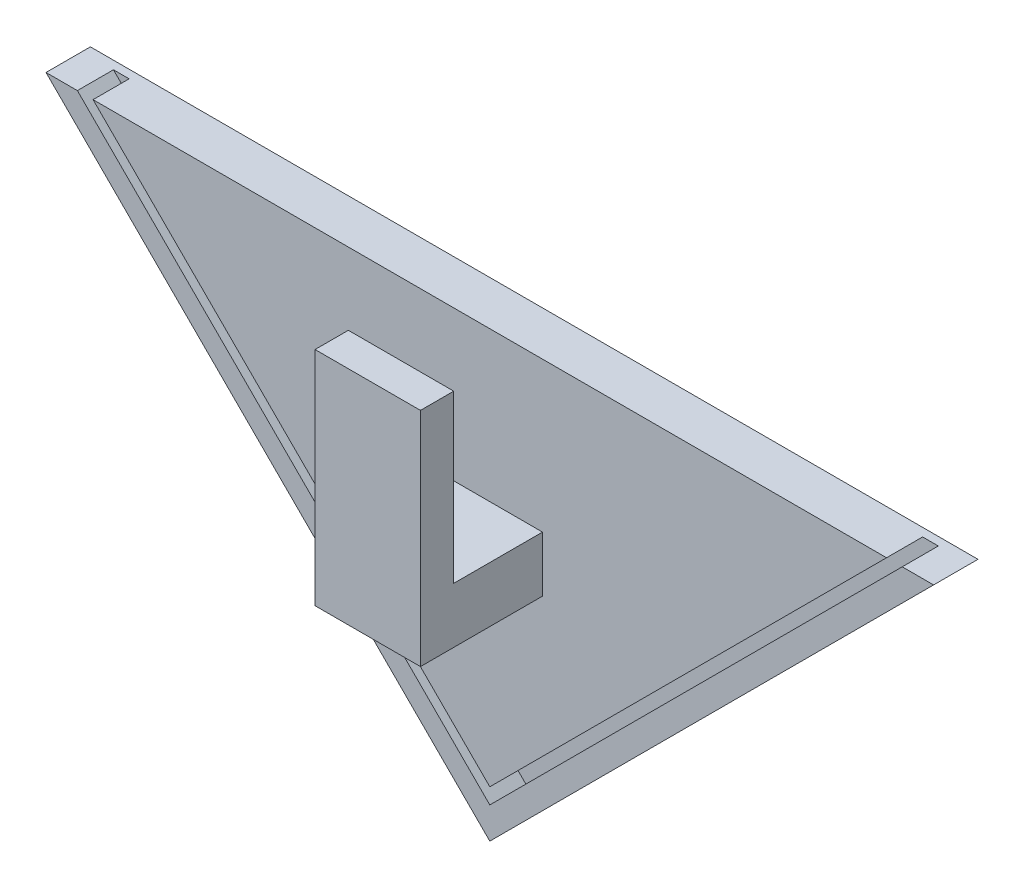
ISO-10303-21;
HEADER;
FILE_DESCRIPTION(('STEP AP214'),'2;1');
FILE_NAME('part.step','',(''),(''),'','','');
FILE_SCHEMA(('AUTOMOTIVE_DESIGN { 1 0 10303 214 1 1 1 1 }'));
ENDSEC;
DATA;
#1=APPLICATION_CONTEXT('core data for automotive mechanical design processes');
#2=APPLICATION_PROTOCOL_DEFINITION('international standard','automotive_design',2000,#1);
#3=PRODUCT_CONTEXT('',#1,'mechanical');
#4=PRODUCT('Part','Part','',(#3));
#5=PRODUCT_RELATED_PRODUCT_CATEGORY('part','',(#4));
#6=PRODUCT_DEFINITION_FORMATION('','',#4);
#7=PRODUCT_DEFINITION_CONTEXT('part definition',#1,'design');
#8=PRODUCT_DEFINITION('design','',#6,#7);
#9=PRODUCT_DEFINITION_SHAPE('','',#8);
#10=(LENGTH_UNIT() NAMED_UNIT(*) SI_UNIT(.MILLI.,.METRE.));
#11=(NAMED_UNIT(*) PLANE_ANGLE_UNIT() SI_UNIT($,.RADIAN.));
#12=(NAMED_UNIT(*) SI_UNIT($,.STERADIAN.) SOLID_ANGLE_UNIT());
#13=UNCERTAINTY_MEASURE_WITH_UNIT(LENGTH_MEASURE(1.E-05),#10,'distance_accuracy_value','');
#14=(GEOMETRIC_REPRESENTATION_CONTEXT(3) GLOBAL_UNCERTAINTY_ASSIGNED_CONTEXT((#13)) GLOBAL_UNIT_ASSIGNED_CONTEXT((#10,
#11,#12)) REPRESENTATION_CONTEXT('',''));
#15=CARTESIAN_POINT('',(0.,0.,0.));
#16=DIRECTION('',(0.,0.,1.));
#17=DIRECTION('',(1.,0.,0.));
#18=AXIS2_PLACEMENT_3D('',#15,#16,#17);
#19=CARTESIAN_POINT('',(0.,0.,4.));
#20=DIRECTION('',(0.,0.,-1.));
#21=DIRECTION('',(-1.,0.,0.));
#22=AXIS2_PLACEMENT_3D('',#19,#20,#21);
#23=PLANE('',#22);
#24=DIRECTION('',(-1.,0.,0.));
#25=VECTOR('',#24,1.);
#26=CARTESIAN_POINT('',(39.9999999999999,40.,4.));
#27=LINE('',#26,#25);
#28=CARTESIAN_POINT('',(35.7573593128806,40.,4.));
#29=VERTEX_POINT('',#28);
#30=CARTESIAN_POINT('',(-35.7573593128806,40.,4.));
#31=VERTEX_POINT('',#30);
#32=EDGE_CURVE('E286',#29,#31,#27,.T.);
#33=ORIENTED_EDGE('',*,*,#32,.T.);
#34=DIRECTION('',(-0.707106781186548,0.707106781186548,0.));
#35=VECTOR('',#34,1.);
#36=CARTESIAN_POINT('',(0.,4.24264068711942,4.));
#37=LINE('',#36,#35);
#38=CARTESIAN_POINT('',(0.,4.24264068711942,4.));
#39=VERTEX_POINT('',#38);
#40=EDGE_CURVE('E249',#39,#31,#37,.T.);
#41=ORIENTED_EDGE('',*,*,#40,.F.);
#42=DIRECTION('',(-0.707106781186547,-0.707106781186548,0.));
#43=VECTOR('',#42,1.);
#44=CARTESIAN_POINT('',(35.7573593128806,40.,4.));
#45=LINE('',#44,#43);
#46=EDGE_CURVE('E245',#29,#39,#45,.T.);
#47=ORIENTED_EDGE('',*,*,#46,.F.);
#48=EDGE_LOOP('',(#33,#41,#47));
#49=FACE_BOUND('',#48,.T.);
#50=DIRECTION('',(0.,1.,0.));
#51=VECTOR('',#50,1.);
#52=CARTESIAN_POINT('',(4.75,21.5,4.));
#53=LINE('',#52,#51);
#54=CARTESIAN_POINT('',(4.75,21.5,4.));
#55=VERTEX_POINT('',#54);
#56=CARTESIAN_POINT('',(4.75,26.5,4.));
#57=VERTEX_POINT('',#56);
#58=EDGE_CURVE('E195',#55,#57,#53,.T.);
#59=ORIENTED_EDGE('',*,*,#58,.F.);
#60=DIRECTION('',(1.,0.,0.));
#61=VECTOR('',#60,1.);
#62=CARTESIAN_POINT('',(-4.75,21.5,4.));
#63=LINE('',#62,#61);
#64=CARTESIAN_POINT('',(-4.75,21.5,4.));
#65=VERTEX_POINT('',#64);
#66=EDGE_CURVE('E200',#65,#55,#63,.T.);
#67=ORIENTED_EDGE('',*,*,#66,.F.);
#68=DIRECTION('',(0.,-1.,0.));
#69=VECTOR('',#68,1.);
#70=CARTESIAN_POINT('',(-4.75,21.5,4.));
#71=LINE('',#70,#69);
#72=CARTESIAN_POINT('',(-4.75,26.5,4.));
#73=VERTEX_POINT('',#72);
#74=EDGE_CURVE('E60',#73,#65,#71,.T.);
#75=ORIENTED_EDGE('',*,*,#74,.F.);
#76=DIRECTION('',(-1.,0.,0.));
#77=VECTOR('',#76,1.);
#78=CARTESIAN_POINT('',(-4.75,26.5,4.));
#79=LINE('',#78,#77);
#80=EDGE_CURVE('E55',#57,#73,#79,.T.);
#81=ORIENTED_EDGE('',*,*,#80,.F.);
#82=EDGE_LOOP('',(#59,#67,#75,#81));
#83=FACE_BOUND('',#82,.T.);
#84=ADVANCED_FACE('F39',(#49,#83),#23,.F.);
#85=CARTESIAN_POINT('',(39.9999999999999,40.,4.));
#86=VERTEX_POINT('',#85);
#87=CARTESIAN_POINT('',(37.1715728752536,40.,4.));
#88=VERTEX_POINT('',#87);
#89=EDGE_CURVE('E281',#86,#88,#27,.T.);
#90=ORIENTED_EDGE('',*,*,#89,.T.);
#91=DIRECTION('',(0.707106781186547,0.707106781186548,0.));
#92=VECTOR('',#91,1.);
#93=CARTESIAN_POINT('',(37.1715728752536,40.,4.));
#94=LINE('',#93,#92);
#95=CARTESIAN_POINT('',(0.,2.82842712474633,4.));
#96=VERTEX_POINT('',#95);
#97=EDGE_CURVE('E217',#96,#88,#94,.T.);
#98=ORIENTED_EDGE('',*,*,#97,.F.);
#99=DIRECTION('',(0.707106781186548,-0.707106781186547,0.));
#100=VECTOR('',#99,1.);
#101=CARTESIAN_POINT('',(0.,2.82842712474633,4.));
#102=LINE('',#101,#100);
#103=CARTESIAN_POINT('',(-37.1715728752537,40.,4.));
#104=VERTEX_POINT('',#103);
#105=EDGE_CURVE('E223',#104,#96,#102,.T.);
#106=ORIENTED_EDGE('',*,*,#105,.F.);
#107=CARTESIAN_POINT('',(-39.9999999999999,40.,4.));
#108=VERTEX_POINT('',#107);
#109=EDGE_CURVE('E279',#104,#108,#27,.T.);
#110=ORIENTED_EDGE('',*,*,#109,.T.);
#111=DIRECTION('',(0.707106781186546,-0.707106781186549,0.));
#112=VECTOR('',#111,1.);
#113=CARTESIAN_POINT('',(-39.9999999999999,40.,4.));
#114=LINE('',#113,#112);
#115=CARTESIAN_POINT('',(0.,0.,4.));
#116=VERTEX_POINT('',#115);
#117=EDGE_CURVE('E285',#108,#116,#114,.T.);
#118=ORIENTED_EDGE('',*,*,#117,.T.);
#119=DIRECTION('',(0.707106781186546,0.707106781186549,0.));
#120=VECTOR('',#119,1.);
#121=CARTESIAN_POINT('',(0.,0.,4.));
#122=LINE('',#121,#120);
#123=EDGE_CURVE('E275',#116,#86,#122,.T.);
#124=ORIENTED_EDGE('',*,*,#123,.T.);
#125=EDGE_LOOP('',(#90,#98,#106,#110,#118,#124));
#126=FACE_BOUND('',#125,.T.);
#127=ADVANCED_FACE('F317',(#126),#23,.F.);
#128=CARTESIAN_POINT('',(0.,0.,4.));
#129=DIRECTION('',(-0.707106781186549,0.707106781186546,0.));
#130=DIRECTION('',(-0.707106781186546,-0.707106781186549,0.));
#131=AXIS2_PLACEMENT_3D('',#128,#129,#130);
#132=PLANE('',#131);
#133=DIRECTION('',(0.707106781186546,0.707106781186549,0.));
#134=VECTOR('',#133,1.);
#135=CARTESIAN_POINT('',(0.,0.,0.));
#136=LINE('',#135,#134);
#137=CARTESIAN_POINT('',(0.,0.,0.));
#138=VERTEX_POINT('',#137);
#139=CARTESIAN_POINT('',(39.9999999999999,40.,0.));
#140=VERTEX_POINT('',#139);
#141=EDGE_CURVE('E258',#138,#140,#136,.T.);
#142=ORIENTED_EDGE('',*,*,#141,.T.);
#143=DIRECTION('',(0.,0.,-1.));
#144=VECTOR('',#143,1.);
#145=CARTESIAN_POINT('',(39.9999999999999,40.,4.));
#146=LINE('',#145,#144);
#147=EDGE_CURVE('E11',#86,#140,#146,.T.);
#148=ORIENTED_EDGE('',*,*,#147,.F.);
#149=ORIENTED_EDGE('',*,*,#123,.F.);
#150=DIRECTION('',(0.,0.,-1.));
#151=VECTOR('',#150,1.);
#152=CARTESIAN_POINT('',(0.,0.,4.));
#153=LINE('',#152,#151);
#154=EDGE_CURVE('E289',#116,#138,#153,.T.);
#155=ORIENTED_EDGE('',*,*,#154,.T.);
#156=EDGE_LOOP('',(#142,#148,#149,#155));
#157=FACE_BOUND('',#156,.T.);
#158=ADVANCED_FACE('F41',(#157),#132,.F.);
#159=CARTESIAN_POINT('',(39.9999999999999,40.,4.));
#160=DIRECTION('',(0.,-1.,0.));
#161=DIRECTION('',(0.,0.,-1.));
#162=AXIS2_PLACEMENT_3D('',#159,#160,#161);
#163=PLANE('',#162);
#164=ORIENTED_EDGE('',*,*,#109,.F.);
#165=DIRECTION('',(0.,0.,1.));
#166=VECTOR('',#165,1.);
#167=CARTESIAN_POINT('',(-37.1715728752537,40.,0.75));
#168=LINE('',#167,#166);
#169=CARTESIAN_POINT('',(-37.1715728752537,40.,0.75));
#170=VERTEX_POINT('',#169);
#171=EDGE_CURVE('E259',#170,#104,#168,.T.);
#172=ORIENTED_EDGE('',*,*,#171,.F.);
#173=DIRECTION('',(-1.,0.,0.));
#174=VECTOR('',#173,1.);
#175=CARTESIAN_POINT('',(-37.1715728752537,40.,0.75));
#176=LINE('',#175,#174);
#177=CARTESIAN_POINT('',(-35.7573593128806,40.,0.75));
#178=VERTEX_POINT('',#177);
#179=EDGE_CURVE('E235',#178,#170,#176,.T.);
#180=ORIENTED_EDGE('',*,*,#179,.F.);
#181=DIRECTION('',(0.,0.,1.));
#182=VECTOR('',#181,1.);
#183=CARTESIAN_POINT('',(-35.7573593128806,40.,0.75));
#184=LINE('',#183,#182);
#185=EDGE_CURVE('E262',#178,#31,#184,.T.);
#186=ORIENTED_EDGE('',*,*,#185,.T.);
#187=ORIENTED_EDGE('',*,*,#32,.F.);
#188=DIRECTION('',(0.,0.,1.));
#189=VECTOR('',#188,1.);
#190=CARTESIAN_POINT('',(35.7573593128806,40.,0.75));
#191=LINE('',#190,#189);
#192=CARTESIAN_POINT('',(35.7573593128806,40.,0.75));
#193=VERTEX_POINT('',#192);
#194=EDGE_CURVE('E269',#193,#29,#191,.T.);
#195=ORIENTED_EDGE('',*,*,#194,.F.);
#196=DIRECTION('',(-1.,0.,0.));
#197=VECTOR('',#196,1.);
#198=CARTESIAN_POINT('',(37.1715728752536,40.,0.75));
#199=LINE('',#198,#197);
#200=CARTESIAN_POINT('',(37.1715728752536,40.,0.75));
#201=VERTEX_POINT('',#200);
#202=EDGE_CURVE('E222',#201,#193,#199,.T.);
#203=ORIENTED_EDGE('',*,*,#202,.F.);
#204=DIRECTION('',(0.,0.,1.));
#205=VECTOR('',#204,1.);
#206=CARTESIAN_POINT('',(37.1715728752536,40.,0.75));
#207=LINE('',#206,#205);
#208=EDGE_CURVE('E242',#201,#88,#207,.T.);
#209=ORIENTED_EDGE('',*,*,#208,.T.);
#210=ORIENTED_EDGE('',*,*,#89,.F.);
#211=ORIENTED_EDGE('',*,*,#147,.T.);
#212=DIRECTION('',(-1.,0.,0.));
#213=VECTOR('',#212,1.);
#214=CARTESIAN_POINT('',(39.9999999999999,40.,0.));
#215=LINE('',#214,#213);
#216=CARTESIAN_POINT('',(-39.9999999999999,40.,0.));
#217=VERTEX_POINT('',#216);
#218=EDGE_CURVE('E293',#140,#217,#215,.T.);
#219=ORIENTED_EDGE('',*,*,#218,.T.);
#220=DIRECTION('',(0.,0.,-1.));
#221=VECTOR('',#220,1.);
#222=CARTESIAN_POINT('',(-39.9999999999999,40.,4.));
#223=LINE('',#222,#221);
#224=EDGE_CURVE('E48',#108,#217,#223,.T.);
#225=ORIENTED_EDGE('',*,*,#224,.F.);
#226=EDGE_LOOP('',(#164,#172,#180,#186,#187,#195,#203,#209,#210,#211,#219,#225));
#227=FACE_BOUND('',#226,.T.);
#228=ADVANCED_FACE('F329',(#227),#163,.F.);
#229=CARTESIAN_POINT('',(-39.9999999999999,40.,4.));
#230=DIRECTION('',(0.707106781186549,0.707106781186546,0.));
#231=DIRECTION('',(-0.707106781186546,0.707106781186549,0.));
#232=AXIS2_PLACEMENT_3D('',#229,#230,#231);
#233=PLANE('',#232);
#234=DIRECTION('',(0.707106781186546,-0.707106781186549,0.));
#235=VECTOR('',#234,1.);
#236=CARTESIAN_POINT('',(-39.9999999999999,40.,0.));
#237=LINE('',#236,#235);
#238=EDGE_CURVE('E280',#217,#138,#237,.T.);
#239=ORIENTED_EDGE('',*,*,#238,.T.);
#240=ORIENTED_EDGE('',*,*,#154,.F.);
#241=ORIENTED_EDGE('',*,*,#117,.F.);
#242=ORIENTED_EDGE('',*,*,#224,.T.);
#243=EDGE_LOOP('',(#239,#240,#241,#242));
#244=FACE_BOUND('',#243,.T.);
#245=ADVANCED_FACE('F306',(#244),#233,.F.);
#246=CARTESIAN_POINT('',(0.,0.,0.));
#247=DIRECTION('',(0.,0.,-1.));
#248=DIRECTION('',(-1.,0.,0.));
#249=AXIS2_PLACEMENT_3D('',#246,#247,#248);
#250=PLANE('',#249);
#251=ORIENTED_EDGE('',*,*,#141,.F.);
#252=ORIENTED_EDGE('',*,*,#238,.F.);
#253=ORIENTED_EDGE('',*,*,#218,.F.);
#254=EDGE_LOOP('',(#251,#252,#253));
#255=FACE_BOUND('',#254,.T.);
#256=ADVANCED_FACE('F312',(#255),#250,.T.);
#257=CARTESIAN_POINT('',(37.1715728752536,40.,0.75));
#258=DIRECTION('',(0.707106781186548,-0.707106781186547,0.));
#259=DIRECTION('',(0.707106781186547,0.707106781186548,0.));
#260=AXIS2_PLACEMENT_3D('',#257,#258,#259);
#261=PLANE('',#260);
#262=ORIENTED_EDGE('',*,*,#97,.T.);
#263=ORIENTED_EDGE('',*,*,#208,.F.);
#264=DIRECTION('',(0.707106781186547,0.707106781186548,0.));
#265=VECTOR('',#264,1.);
#266=CARTESIAN_POINT('',(37.1715728752536,40.,0.75));
#267=LINE('',#266,#265);
#268=CARTESIAN_POINT('',(0.,2.82842712474633,0.75));
#269=VERTEX_POINT('',#268);
#270=EDGE_CURVE('E218',#269,#201,#267,.T.);
#271=ORIENTED_EDGE('',*,*,#270,.F.);
#272=DIRECTION('',(0.,0.,1.));
#273=VECTOR('',#272,1.);
#274=CARTESIAN_POINT('',(0.,2.82842712474633,0.75));
#275=LINE('',#274,#273);
#276=EDGE_CURVE('E255',#269,#96,#275,.T.);
#277=ORIENTED_EDGE('',*,*,#276,.T.);
#278=EDGE_LOOP('',(#262,#263,#271,#277));
#279=FACE_BOUND('',#278,.T.);
#280=ADVANCED_FACE('F357',(#279),#261,.F.);
#281=CARTESIAN_POINT('',(0.,2.82842712474633,0.75));
#282=DIRECTION('',(-0.707106781186547,-0.707106781186548,0.));
#283=DIRECTION('',(0.707106781186548,-0.707106781186547,0.));
#284=AXIS2_PLACEMENT_3D('',#281,#282,#283);
#285=PLANE('',#284);
#286=ORIENTED_EDGE('',*,*,#105,.T.);
#287=ORIENTED_EDGE('',*,*,#276,.F.);
#288=DIRECTION('',(0.707106781186548,-0.707106781186547,0.));
#289=VECTOR('',#288,1.);
#290=CARTESIAN_POINT('',(0.,2.82842712474633,0.75));
#291=LINE('',#290,#289);
#292=EDGE_CURVE('E238',#170,#269,#291,.T.);
#293=ORIENTED_EDGE('',*,*,#292,.F.);
#294=ORIENTED_EDGE('',*,*,#171,.T.);
#295=EDGE_LOOP('',(#286,#287,#293,#294));
#296=FACE_BOUND('',#295,.T.);
#297=ADVANCED_FACE('F348',(#296),#285,.F.);
#298=CARTESIAN_POINT('',(0.,4.24264068711942,0.75));
#299=DIRECTION('',(0.707106781186548,0.707106781186548,0.));
#300=DIRECTION('',(-0.707106781186548,0.707106781186548,0.));
#301=AXIS2_PLACEMENT_3D('',#298,#299,#300);
#302=PLANE('',#301);
#303=ORIENTED_EDGE('',*,*,#40,.T.);
#304=ORIENTED_EDGE('',*,*,#185,.F.);
#305=DIRECTION('',(-0.707106781186548,0.707106781186548,0.));
#306=VECTOR('',#305,1.);
#307=CARTESIAN_POINT('',(0.,4.24264068711942,0.75));
#308=LINE('',#307,#306);
#309=CARTESIAN_POINT('',(0.,4.24264068711942,0.75));
#310=VERTEX_POINT('',#309);
#311=EDGE_CURVE('E231',#310,#178,#308,.T.);
#312=ORIENTED_EDGE('',*,*,#311,.F.);
#313=DIRECTION('',(0.,0.,1.));
#314=VECTOR('',#313,1.);
#315=CARTESIAN_POINT('',(0.,4.24264068711942,0.75));
#316=LINE('',#315,#314);
#317=EDGE_CURVE('E266',#310,#39,#316,.T.);
#318=ORIENTED_EDGE('',*,*,#317,.T.);
#319=EDGE_LOOP('',(#303,#304,#312,#318));
#320=FACE_BOUND('',#319,.T.);
#321=ADVANCED_FACE('F334',(#320),#302,.F.);
#322=CARTESIAN_POINT('',(35.7573593128806,40.,0.75));
#323=DIRECTION('',(-0.707106781186548,0.707106781186547,0.));
#324=DIRECTION('',(-0.707106781186547,-0.707106781186548,0.));
#325=AXIS2_PLACEMENT_3D('',#322,#323,#324);
#326=PLANE('',#325);
#327=ORIENTED_EDGE('',*,*,#46,.T.);
#328=ORIENTED_EDGE('',*,*,#317,.F.);
#329=DIRECTION('',(-0.707106781186547,-0.707106781186548,0.));
#330=VECTOR('',#329,1.);
#331=CARTESIAN_POINT('',(35.7573593128806,40.,0.75));
#332=LINE('',#331,#330);
#333=EDGE_CURVE('E227',#193,#310,#332,.T.);
#334=ORIENTED_EDGE('',*,*,#333,.F.);
#335=ORIENTED_EDGE('',*,*,#194,.T.);
#336=EDGE_LOOP('',(#327,#328,#334,#335));
#337=FACE_BOUND('',#336,.T.);
#338=ADVANCED_FACE('F339',(#337),#326,.F.);
#339=CARTESIAN_POINT('',(0.,0.,0.75));
#340=DIRECTION('',(0.,0.,-1.));
#341=DIRECTION('',(-1.,0.,0.));
#342=AXIS2_PLACEMENT_3D('',#339,#340,#341);
#343=PLANE('',#342);
#344=ORIENTED_EDGE('',*,*,#270,.T.);
#345=ORIENTED_EDGE('',*,*,#202,.T.);
#346=ORIENTED_EDGE('',*,*,#333,.T.);
#347=ORIENTED_EDGE('',*,*,#311,.T.);
#348=ORIENTED_EDGE('',*,*,#179,.T.);
#349=ORIENTED_EDGE('',*,*,#292,.T.);
#350=EDGE_LOOP('',(#344,#345,#346,#347,#348,#349));
#351=FACE_BOUND('',#350,.T.);
#352=ADVANCED_FACE('F336',(#351),#343,.F.);
#353=CARTESIAN_POINT('',(4.75,21.5,12.));
#354=DIRECTION('',(-1.,0.,0.));
#355=DIRECTION('',(0.,0.,1.));
#356=AXIS2_PLACEMENT_3D('',#353,#354,#355);
#357=PLANE('',#356);
#358=ORIENTED_EDGE('',*,*,#58,.T.);
#359=DIRECTION('',(0.,0.,-1.));
#360=VECTOR('',#359,1.);
#361=CARTESIAN_POINT('',(4.75,26.5,12.));
#362=LINE('',#361,#360);
#363=CARTESIAN_POINT('',(4.75,26.5,12.));
#364=VERTEX_POINT('',#363);
#365=EDGE_CURVE('E214',#364,#57,#362,.T.);
#366=ORIENTED_EDGE('',*,*,#365,.F.);
#367=DIRECTION('',(0.,1.,0.));
#368=VECTOR('',#367,1.);
#369=CARTESIAN_POINT('',(4.75,21.5,12.));
#370=LINE('',#369,#368);
#371=CARTESIAN_POINT('',(4.75,41.5,12.));
#372=VERTEX_POINT('',#371);
#373=EDGE_CURVE('E175',#364,#372,#370,.T.);
#374=ORIENTED_EDGE('',*,*,#373,.T.);
#375=DIRECTION('',(0.,0.,-1.));
#376=VECTOR('',#375,1.);
#377=CARTESIAN_POINT('',(4.75,41.5,15.));
#378=LINE('',#377,#376);
#379=CARTESIAN_POINT('',(4.75,41.5,15.));
#380=VERTEX_POINT('',#379);
#381=EDGE_CURVE('E191',#380,#372,#378,.T.);
#382=ORIENTED_EDGE('',*,*,#381,.F.);
#383=DIRECTION('',(0.,1.,0.));
#384=VECTOR('',#383,1.);
#385=CARTESIAN_POINT('',(4.75,21.5,15.));
#386=LINE('',#385,#384);
#387=CARTESIAN_POINT('',(4.75,21.5,15.));
#388=VERTEX_POINT('',#387);
#389=EDGE_CURVE('E165',#388,#380,#386,.T.);
#390=ORIENTED_EDGE('',*,*,#389,.F.);
#391=DIRECTION('',(0.,0.,-1.));
#392=VECTOR('',#391,1.);
#393=CARTESIAN_POINT('',(4.75,21.5,12.));
#394=LINE('',#393,#392);
#395=EDGE_CURVE('E156',#388,#55,#394,.T.);
#396=ORIENTED_EDGE('',*,*,#395,.T.);
#397=EDGE_LOOP('',(#358,#366,#374,#382,#390,#396));
#398=FACE_BOUND('',#397,.T.);
#399=ADVANCED_FACE('F346',(#398),#357,.F.);
#400=CARTESIAN_POINT('',(-4.75,26.5,12.));
#401=DIRECTION('',(0.,-1.,0.));
#402=DIRECTION('',(0.,0.,-1.));
#403=AXIS2_PLACEMENT_3D('',#400,#401,#402);
#404=PLANE('',#403);
#405=ORIENTED_EDGE('',*,*,#80,.T.);
#406=DIRECTION('',(0.,0.,-1.));
#407=VECTOR('',#406,1.);
#408=CARTESIAN_POINT('',(-4.75,26.5,12.));
#409=LINE('',#408,#407);
#410=CARTESIAN_POINT('',(-4.75,26.5,12.));
#411=VERTEX_POINT('',#410);
#412=EDGE_CURVE('E155',#411,#73,#409,.T.);
#413=ORIENTED_EDGE('',*,*,#412,.F.);
#414=DIRECTION('',(-1.,0.,0.));
#415=VECTOR('',#414,1.);
#416=CARTESIAN_POINT('',(-4.75,26.5,12.));
#417=LINE('',#416,#415);
#418=EDGE_CURVE('E196',#364,#411,#417,.T.);
#419=ORIENTED_EDGE('',*,*,#418,.F.);
#420=ORIENTED_EDGE('',*,*,#365,.T.);
#421=EDGE_LOOP('',(#405,#413,#419,#420));
#422=FACE_BOUND('',#421,.T.);
#423=ADVANCED_FACE('F427',(#422),#404,.F.);
#424=CARTESIAN_POINT('',(-4.75,21.5,12.));
#425=DIRECTION('',(1.,0.,0.));
#426=DIRECTION('',(0.,0.,-1.));
#427=AXIS2_PLACEMENT_3D('',#424,#425,#426);
#428=PLANE('',#427);
#429=ORIENTED_EDGE('',*,*,#74,.T.);
#430=DIRECTION('',(0.,0.,-1.));
#431=VECTOR('',#430,1.);
#432=CARTESIAN_POINT('',(-4.75,21.5,12.));
#433=LINE('',#432,#431);
#434=CARTESIAN_POINT('',(-4.75,21.5,15.));
#435=VERTEX_POINT('',#434);
#436=EDGE_CURVE('E145',#435,#65,#433,.T.);
#437=ORIENTED_EDGE('',*,*,#436,.F.);
#438=DIRECTION('',(0.,-1.,0.));
#439=VECTOR('',#438,1.);
#440=CARTESIAN_POINT('',(-4.75,21.5,15.));
#441=LINE('',#440,#439);
#442=CARTESIAN_POINT('',(-4.75,41.5,15.));
#443=VERTEX_POINT('',#442);
#444=EDGE_CURVE('E150',#443,#435,#441,.T.);
#445=ORIENTED_EDGE('',*,*,#444,.F.);
#446=DIRECTION('',(0.,0.,-1.));
#447=VECTOR('',#446,1.);
#448=CARTESIAN_POINT('',(-4.75,41.5,15.));
#449=LINE('',#448,#447);
#450=CARTESIAN_POINT('',(-4.75,41.5,12.));
#451=VERTEX_POINT('',#450);
#452=EDGE_CURVE('E182',#443,#451,#449,.T.);
#453=ORIENTED_EDGE('',*,*,#452,.T.);
#454=DIRECTION('',(0.,-1.,0.));
#455=VECTOR('',#454,1.);
#456=CARTESIAN_POINT('',(-4.75,21.5,12.));
#457=LINE('',#456,#455);
#458=EDGE_CURVE('E183',#451,#411,#457,.T.);
#459=ORIENTED_EDGE('',*,*,#458,.T.);
#460=ORIENTED_EDGE('',*,*,#412,.T.);
#461=EDGE_LOOP('',(#429,#437,#445,#453,#459,#460));
#462=FACE_BOUND('',#461,.T.);
#463=ADVANCED_FACE('F147',(#462),#428,.F.);
#464=CARTESIAN_POINT('',(-4.75,21.5,12.));
#465=DIRECTION('',(0.,1.,0.));
#466=DIRECTION('',(0.,0.,1.));
#467=AXIS2_PLACEMENT_3D('',#464,#465,#466);
#468=PLANE('',#467);
#469=ORIENTED_EDGE('',*,*,#66,.T.);
#470=ORIENTED_EDGE('',*,*,#395,.F.);
#471=DIRECTION('',(1.,0.,0.));
#472=VECTOR('',#471,1.);
#473=CARTESIAN_POINT('',(-4.75,21.5,15.));
#474=LINE('',#473,#472);
#475=EDGE_CURVE('E159',#435,#388,#474,.T.);
#476=ORIENTED_EDGE('',*,*,#475,.F.);
#477=ORIENTED_EDGE('',*,*,#436,.T.);
#478=EDGE_LOOP('',(#469,#470,#476,#477));
#479=FACE_BOUND('',#478,.T.);
#480=ADVANCED_FACE('F160',(#479),#468,.F.);
#481=CARTESIAN_POINT('',(-4.75,41.5,15.));
#482=DIRECTION('',(0.,-1.,0.));
#483=DIRECTION('',(0.,0.,-1.));
#484=AXIS2_PLACEMENT_3D('',#481,#482,#483);
#485=PLANE('',#484);
#486=DIRECTION('',(-1.,0.,0.));
#487=VECTOR('',#486,1.);
#488=CARTESIAN_POINT('',(-4.75,41.5,12.));
#489=LINE('',#488,#487);
#490=EDGE_CURVE('E172',#372,#451,#489,.T.);
#491=ORIENTED_EDGE('',*,*,#490,.T.);
#492=ORIENTED_EDGE('',*,*,#452,.F.);
#493=DIRECTION('',(-1.,0.,0.));
#494=VECTOR('',#493,1.);
#495=CARTESIAN_POINT('',(-4.75,41.5,15.));
#496=LINE('',#495,#494);
#497=EDGE_CURVE('E169',#380,#443,#496,.T.);
#498=ORIENTED_EDGE('',*,*,#497,.F.);
#499=ORIENTED_EDGE('',*,*,#381,.T.);
#500=EDGE_LOOP('',(#491,#492,#498,#499));
#501=FACE_BOUND('',#500,.T.);
#502=ADVANCED_FACE('F456',(#501),#485,.F.);
#503=CARTESIAN_POINT('',(0.,0.,15.));
#504=DIRECTION('',(0.,0.,-1.));
#505=DIRECTION('',(-1.,0.,0.));
#506=AXIS2_PLACEMENT_3D('',#503,#504,#505);
#507=PLANE('',#506);
#508=ORIENTED_EDGE('',*,*,#444,.T.);
#509=ORIENTED_EDGE('',*,*,#475,.T.);
#510=ORIENTED_EDGE('',*,*,#389,.T.);
#511=ORIENTED_EDGE('',*,*,#497,.T.);
#512=EDGE_LOOP('',(#508,#509,#510,#511));
#513=FACE_BOUND('',#512,.T.);
#514=ADVANCED_FACE('F167',(#513),#507,.F.);
#515=CARTESIAN_POINT('',(0.,0.,12.));
#516=DIRECTION('',(0.,0.,-1.));
#517=DIRECTION('',(-1.,0.,0.));
#518=AXIS2_PLACEMENT_3D('',#515,#516,#517);
#519=PLANE('',#518);
#520=ORIENTED_EDGE('',*,*,#373,.F.);
#521=ORIENTED_EDGE('',*,*,#418,.T.);
#522=ORIENTED_EDGE('',*,*,#458,.F.);
#523=ORIENTED_EDGE('',*,*,#490,.F.);
#524=EDGE_LOOP('',(#520,#521,#522,#523));
#525=FACE_BOUND('',#524,.T.);
#526=ADVANCED_FACE('F474',(#525),#519,.T.);
#527=CLOSED_SHELL('',(#84,#127,#158,#228,#245,#256,#280,#297,#321,#338,#352,#399,#423,#463,#480,
#502,#514,#526));
#528=MANIFOLD_SOLID_BREP('B2',#527);
#529=ADVANCED_BREP_SHAPE_REPRESENTATION('',(#18,#528),#14);
#530=SHAPE_DEFINITION_REPRESENTATION(#9,#529);
ENDSEC;
END-ISO-10303-21;
